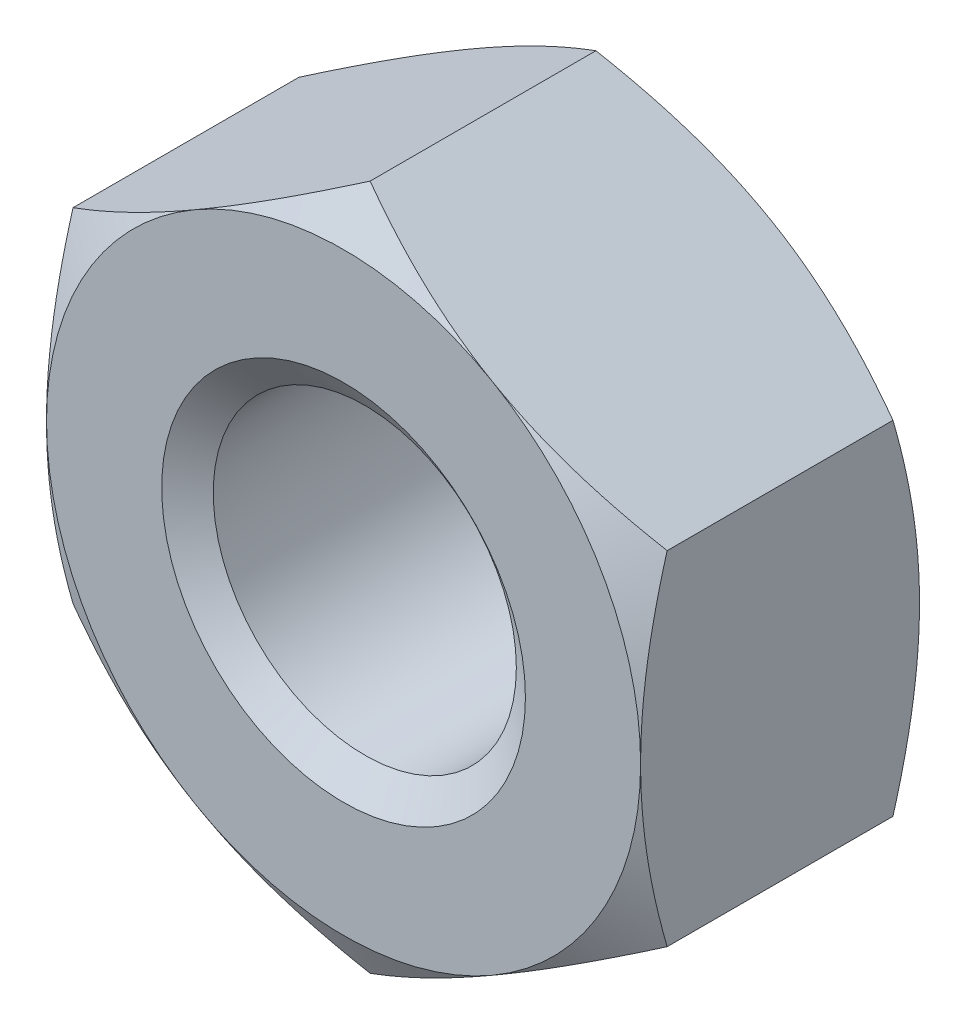
ISO-10303-21;
HEADER;
FILE_DESCRIPTION(('STEP AP214'),'2;1');
FILE_NAME('part.step','',(''),(''),'','','');
FILE_SCHEMA(('AUTOMOTIVE_DESIGN { 1 0 10303 214 1 1 1 1 }'));
ENDSEC;
DATA;
#1=APPLICATION_CONTEXT('core data for automotive mechanical design processes');
#2=APPLICATION_PROTOCOL_DEFINITION('international standard','automotive_design',2000,#1);
#3=PRODUCT_CONTEXT('',#1,'mechanical');
#4=PRODUCT('Part','Part','',(#3));
#5=PRODUCT_RELATED_PRODUCT_CATEGORY('part','',(#4));
#6=PRODUCT_DEFINITION_FORMATION('','',#4);
#7=PRODUCT_DEFINITION_CONTEXT('part definition',#1,'design');
#8=PRODUCT_DEFINITION('design','',#6,#7);
#9=PRODUCT_DEFINITION_SHAPE('','',#8);
#10=(LENGTH_UNIT() NAMED_UNIT(*) SI_UNIT(.MILLI.,.METRE.));
#11=(NAMED_UNIT(*) PLANE_ANGLE_UNIT() SI_UNIT($,.RADIAN.));
#12=(NAMED_UNIT(*) SI_UNIT($,.STERADIAN.) SOLID_ANGLE_UNIT());
#13=UNCERTAINTY_MEASURE_WITH_UNIT(LENGTH_MEASURE(1.E-05),#10,'distance_accuracy_value','');
#14=(GEOMETRIC_REPRESENTATION_CONTEXT(3) GLOBAL_UNCERTAINTY_ASSIGNED_CONTEXT((#13)) GLOBAL_UNIT_ASSIGNED_CONTEXT((#10,
#11,#12)) REPRESENTATION_CONTEXT('',''));
#15=CARTESIAN_POINT('',(0.,0.,0.));
#16=DIRECTION('',(0.,0.,1.));
#17=DIRECTION('',(1.,0.,0.));
#18=AXIS2_PLACEMENT_3D('',#15,#16,#17);
#19=CARTESIAN_POINT('',(0.,0.,-2.3));
#20=DIRECTION('',(0.,0.,1.));
#21=DIRECTION('',(1.,0.,0.));
#22=AXIS2_PLACEMENT_3D('',#19,#20,#21);
#23=CYLINDRICAL_SURFACE('',#22,1.25);
#24=CARTESIAN_POINT('',(0.,0.,-0.175051884552426));
#25=DIRECTION('',(0.,0.,1.));
#26=DIRECTION('',(1.,0.,0.));
#27=AXIS2_PLACEMENT_3D('',#24,#25,#26);
#28=CIRCLE('',#27,1.25);
#29=CARTESIAN_POINT('',(1.25,0.,-0.175051884552426));
#30=VERTEX_POINT('',#29);
#31=EDGE_CURVE('E176',#30,#30,#28,.F.);
#32=ORIENTED_EDGE('',*,*,#31,.F.);
#33=EDGE_LOOP('',(#32));
#34=FACE_BOUND('',#33,.T.);
#35=CARTESIAN_POINT('',(0.,0.,-2.09954811544757));
#36=DIRECTION('',(0.,0.,-1.));
#37=DIRECTION('',(-1.,0.,0.));
#38=AXIS2_PLACEMENT_3D('',#35,#36,#37);
#39=CIRCLE('',#38,1.25);
#40=CARTESIAN_POINT('',(-1.25,0.,-2.09954811544757));
#41=VERTEX_POINT('',#40);
#42=EDGE_CURVE('E41',#41,#41,#39,.F.);
#43=ORIENTED_EDGE('',*,*,#42,.F.);
#44=EDGE_LOOP('',(#43));
#45=FACE_BOUND('',#44,.T.);
#46=ADVANCED_FACE('F36',(#34,#45),#23,.F.);
#47=CARTESIAN_POINT('',(0.,2.82901631902917,-2.3));
#48=DIRECTION('',(0.,0.,-1.));
#49=DIRECTION('',(-1.,0.,0.));
#50=AXIS2_PLACEMENT_3D('',#47,#48,#49);
#51=PLANE('',#50);
#52=CARTESIAN_POINT('',(0.,0.,-2.3));
#53=DIRECTION('',(0.,0.,-1.));
#54=DIRECTION('',(-1.,0.,0.));
#55=AXIS2_PLACEMENT_3D('',#52,#53,#54);
#56=CIRCLE('',#55,2.45);
#57=CARTESIAN_POINT('',(-2.45,0.,-2.3));
#58=VERTEX_POINT('',#57);
#59=CARTESIAN_POINT('',(-1.225,-2.12176223927187,-2.3));
#60=VERTEX_POINT('',#59);
#61=EDGE_CURVE('E172',#58,#60,#56,.F.);
#62=ORIENTED_EDGE('',*,*,#61,.F.);
#63=CARTESIAN_POINT('',(-1.225,2.12176223927187,-2.3));
#64=VERTEX_POINT('',#63);
#65=EDGE_CURVE('E154',#64,#58,#56,.F.);
#66=ORIENTED_EDGE('',*,*,#65,.F.);
#67=CARTESIAN_POINT('',(1.225,2.12176223927187,-2.3));
#68=VERTEX_POINT('',#67);
#69=EDGE_CURVE('E171',#68,#64,#56,.F.);
#70=ORIENTED_EDGE('',*,*,#69,.F.);
#71=CARTESIAN_POINT('',(0.,0.,-2.3));
#72=DIRECTION('',(0.,0.,1.));
#73=DIRECTION('',(1.,0.,0.));
#74=AXIS2_PLACEMENT_3D('',#71,#72,#73);
#75=CIRCLE('',#74,2.45);
#76=CARTESIAN_POINT('',(2.45,0.,-2.3));
#77=VERTEX_POINT('',#76);
#78=EDGE_CURVE('E246',#77,#68,#75,.T.);
#79=ORIENTED_EDGE('',*,*,#78,.F.);
#80=CARTESIAN_POINT('',(1.225,-2.12176223927187,-2.3));
#81=VERTEX_POINT('',#80);
#82=EDGE_CURVE('E362',#81,#77,#56,.F.);
#83=ORIENTED_EDGE('',*,*,#82,.F.);
#84=EDGE_CURVE('E366',#60,#81,#56,.F.);
#85=ORIENTED_EDGE('',*,*,#84,.F.);
#86=EDGE_LOOP('',(#62,#66,#70,#79,#83,#85));
#87=FACE_BOUND('',#86,.T.);
#88=CARTESIAN_POINT('',(0.,0.,-2.3));
#89=DIRECTION('',(0.,0.,-1.));
#90=DIRECTION('',(-1.,0.,0.));
#91=AXIS2_PLACEMENT_3D('',#88,#89,#90);
#92=CIRCLE('',#91,1.5);
#93=CARTESIAN_POINT('',(-1.5,0.,-2.3));
#94=VERTEX_POINT('',#93);
#95=EDGE_CURVE('E179',#94,#94,#92,.F.);
#96=ORIENTED_EDGE('',*,*,#95,.T.);
#97=EDGE_LOOP('',(#96));
#98=FACE_BOUND('',#97,.T.);
#99=ADVANCED_FACE('F299',(#87,#98),#51,.T.);
#100=CARTESIAN_POINT('',(0.,2.82901631902917,0.));
#101=DIRECTION('',(0.,0.,-1.));
#102=DIRECTION('',(-1.,0.,0.));
#103=AXIS2_PLACEMENT_3D('',#100,#101,#102);
#104=PLANE('',#103);
#105=CARTESIAN_POINT('',(0.,0.,0.));
#106=DIRECTION('',(0.,0.,-1.));
#107=DIRECTION('',(-1.,0.,0.));
#108=AXIS2_PLACEMENT_3D('',#105,#106,#107);
#109=CIRCLE('',#108,2.45);
#110=CARTESIAN_POINT('',(-2.45,0.,0.));
#111=VERTEX_POINT('',#110);
#112=CARTESIAN_POINT('',(-1.225,2.12176223927187,0.));
#113=VERTEX_POINT('',#112);
#114=EDGE_CURVE('E11',#111,#113,#109,.T.);
#115=ORIENTED_EDGE('',*,*,#114,.F.);
#116=CARTESIAN_POINT('',(-1.225,-2.12176223927187,0.));
#117=VERTEX_POINT('',#116);
#118=EDGE_CURVE('E48',#117,#111,#109,.T.);
#119=ORIENTED_EDGE('',*,*,#118,.F.);
#120=CARTESIAN_POINT('',(1.225,-2.12176223927187,0.));
#121=VERTEX_POINT('',#120);
#122=EDGE_CURVE('E175',#121,#117,#109,.T.);
#123=ORIENTED_EDGE('',*,*,#122,.F.);
#124=CARTESIAN_POINT('',(2.45,0.,0.));
#125=VERTEX_POINT('',#124);
#126=EDGE_CURVE('E353',#125,#121,#109,.T.);
#127=ORIENTED_EDGE('',*,*,#126,.F.);
#128=CARTESIAN_POINT('',(0.,0.,0.));
#129=DIRECTION('',(0.,0.,1.));
#130=DIRECTION('',(1.,0.,0.));
#131=AXIS2_PLACEMENT_3D('',#128,#129,#130);
#132=CIRCLE('',#131,2.45);
#133=CARTESIAN_POINT('',(1.225,2.12176223927187,0.));
#134=VERTEX_POINT('',#133);
#135=EDGE_CURVE('E130',#125,#134,#132,.T.);
#136=ORIENTED_EDGE('',*,*,#135,.T.);
#137=EDGE_CURVE('E46',#113,#134,#109,.T.);
#138=ORIENTED_EDGE('',*,*,#137,.F.);
#139=EDGE_LOOP('',(#115,#119,#123,#127,#136,#138));
#140=FACE_BOUND('',#139,.T.);
#141=CARTESIAN_POINT('',(0.,0.,0.));
#142=DIRECTION('',(0.,0.,1.));
#143=DIRECTION('',(1.,0.,0.));
#144=AXIS2_PLACEMENT_3D('',#141,#142,#143);
#145=CIRCLE('',#144,1.5);
#146=CARTESIAN_POINT('',(1.5,0.,0.));
#147=VERTEX_POINT('',#146);
#148=EDGE_CURVE('E178',#147,#147,#145,.T.);
#149=ORIENTED_EDGE('',*,*,#148,.F.);
#150=EDGE_LOOP('',(#149));
#151=FACE_BOUND('',#150,.T.);
#152=ADVANCED_FACE('F251',(#140,#151),#104,.F.);
#153=CARTESIAN_POINT('',(0.,2.82901631902917,-2.3));
#154=DIRECTION('',(-0.500000000000001,0.866025403784438,0.));
#155=DIRECTION('',(-0.866025403784438,-0.500000000000001,0.));
#156=AXIS2_PLACEMENT_3D('',#153,#154,#155);
#157=PLANE('',#156);
#158=DIRECTION('',(0.,0.,1.));
#159=VECTOR('',#158,1.);
#160=CARTESIAN_POINT('',(-2.45,1.41450815951458,-2.3));
#161=LINE('',#160,#159);
#162=CARTESIAN_POINT('',(-2.45,1.41450815951459,-2.08117482618125));
#163=VERTEX_POINT('',#162);
#164=CARTESIAN_POINT('',(-2.45,1.41450815951458,-0.21882517381875));
#165=VERTEX_POINT('',#164);
#166=EDGE_CURVE('E166',#163,#165,#161,.T.);
#167=ORIENTED_EDGE('',*,*,#166,.T.);
#168=CARTESIAN_POINT('',(-2.4502,1.41439268946074,-0.218891844566883));
#169=CARTESIAN_POINT('',(-2.34253396244964,1.47655370522303,-0.182988411688321));
#170=CARTESIAN_POINT('',(-2.23393856064774,1.53925128968611,-0.150335282247698));
#171=CARTESIAN_POINT('',(-2.01486722518451,1.66573218418753,-0.0933383060848325));
#172=CARTESIAN_POINT('',(-1.9043873982785,1.72951774199174,-0.0690146238518089));
#173=CARTESIAN_POINT('',(-1.68479696694195,1.85629833663537,-0.031150432679854));
#174=CARTESIAN_POINT('',(-1.5757201535934,1.9192738641845,-0.0173579317076312));
#175=CARTESIAN_POINT('',(-1.35705315550793,2.04552131439203,-0.000891103358333379));
#176=CARTESIAN_POINT('',(-1.24746376582536,2.10879277802559,0.00179685843942371));
#177=CARTESIAN_POINT('',(-1.04268138665655,2.22702393976399,-0.00378828292929665));
#178=CARTESIAN_POINT('',(-0.947457777178242,2.2820013163295,-0.0106900424059905));
#179=CARTESIAN_POINT('',(-0.757630953811376,2.39159788389978,-0.0325666667375408));
#180=CARTESIAN_POINT('',(-0.663028396736148,2.44621669569319,-0.0475490081983304));
#181=CARTESIAN_POINT('',(-0.472810031788527,2.55603931990051,-0.0850045281449717));
#182=CARTESIAN_POINT('',(-0.377218305088479,2.61122922904308,-0.107636515215253));
#183=CARTESIAN_POINT('',(-0.187460766164464,2.72078579522162,-0.159002542730696));
#184=CARTESIAN_POINT('',(-0.0932925219413348,2.77515385637296,-0.187724510096738));
#185=CARTESIAN_POINT('',(0.00019999999999996,2.82913178908301,-0.218891844566885));
#186=B_SPLINE_CURVE_WITH_KNOTS('',3,(#168,#169,#170,#171,#172,#173,#174,#175,#176,#177,#178,
#179,#180,#181,#182,#183,#184,#185),.UNSPECIFIED.,.F.,.F.,(4,2,2,2,2,2,2,2,4),(0.,
0.388360427091477,0.777654484763214,1.15731317842199,1.53650557919442,1.86670472342472,
2.19720991179685,2.53504727484869,2.87222105175885),.UNSPECIFIED.);
#187=EDGE_CURVE('E135',#165,#113,#186,.T.);
#188=ORIENTED_EDGE('',*,*,#187,.T.);
#189=CARTESIAN_POINT('',(0.,2.82901631902917,-0.218825173818752));
#190=VERTEX_POINT('',#189);
#191=EDGE_CURVE('E55',#113,#190,#186,.T.);
#192=ORIENTED_EDGE('',*,*,#191,.T.);
#193=DIRECTION('',(0.,0.,1.));
#194=VECTOR('',#193,1.);
#195=CARTESIAN_POINT('',(0.,2.82901631902917,-2.3));
#196=LINE('',#195,#194);
#197=CARTESIAN_POINT('',(0.,2.82901631902917,-2.08117482618125));
#198=VERTEX_POINT('',#197);
#199=EDGE_CURVE('E151',#198,#190,#196,.T.);
#200=ORIENTED_EDGE('',*,*,#199,.F.);
#201=CARTESIAN_POINT('',(-2.4502,1.41439268946074,-2.08110815543312));
#202=CARTESIAN_POINT('',(-2.34253396244964,1.47655370522303,-2.11701158831168));
#203=CARTESIAN_POINT('',(-2.23393856064774,1.53925128968611,-2.1496647177523));
#204=CARTESIAN_POINT('',(-2.01486722518451,1.66573218418753,-2.20666169391517));
#205=CARTESIAN_POINT('',(-1.9043873982785,1.72951774199174,-2.23098537614819));
#206=CARTESIAN_POINT('',(-1.68479696694195,1.85629833663537,-2.26884956732015));
#207=CARTESIAN_POINT('',(-1.5757201535934,1.9192738641845,-2.28264206829237));
#208=CARTESIAN_POINT('',(-1.35705315550793,2.04552131439203,-2.29910889664167));
#209=CARTESIAN_POINT('',(-1.24746376582536,2.10879277802559,-2.30179685843942));
#210=CARTESIAN_POINT('',(-1.04268138665655,2.22702393976399,-2.2962117170707));
#211=CARTESIAN_POINT('',(-0.947457777178242,2.2820013163295,-2.28930995759401));
#212=CARTESIAN_POINT('',(-0.757630953811376,2.39159788389978,-2.26743333326246));
#213=CARTESIAN_POINT('',(-0.663028396736148,2.44621669569319,-2.25245099180167));
#214=CARTESIAN_POINT('',(-0.472810031788527,2.55603931990051,-2.21499547185503));
#215=CARTESIAN_POINT('',(-0.377218305088479,2.61122922904308,-2.19236348478475));
#216=CARTESIAN_POINT('',(-0.187460766164464,2.72078579522162,-2.1409974572693));
#217=CARTESIAN_POINT('',(-0.0932925219413351,2.77515385637296,-2.11227548990326));
#218=CARTESIAN_POINT('',(0.000199999999999954,2.82913178908301,-2.08110815543312));
#219=B_SPLINE_CURVE_WITH_KNOTS('',3,(#201,#202,#203,#204,#205,#206,#207,#208,#209,#210,#211,
#212,#213,#214,#215,#216,#217,#218),.UNSPECIFIED.,.F.,.F.,(4,2,2,2,2,2,2,2,4),(0.,
0.388360427091477,0.777654484763214,1.15731317842199,1.53650557919442,1.86670472342472,
2.19720991179685,2.53504727484869,2.87222105175885),.UNSPECIFIED.);
#220=EDGE_CURVE('E169',#64,#198,#219,.T.);
#221=ORIENTED_EDGE('',*,*,#220,.F.);
#222=EDGE_CURVE('E261',#163,#64,#219,.T.);
#223=ORIENTED_EDGE('',*,*,#222,.F.);
#224=EDGE_LOOP('',(#167,#188,#192,#200,#221,#223));
#225=FACE_BOUND('',#224,.T.);
#226=ADVANCED_FACE('F38',(#225),#157,.T.);
#227=CARTESIAN_POINT('',(2.45,1.41450815951458,-2.3));
#228=DIRECTION('',(0.500000000000001,0.866025403784438,0.));
#229=DIRECTION('',(-0.866025403784438,0.500000000000001,0.));
#230=AXIS2_PLACEMENT_3D('',#227,#228,#229);
#231=PLANE('',#230);
#232=ORIENTED_EDGE('',*,*,#199,.T.);
#233=CARTESIAN_POINT('',(-0.000200000000000147,2.82913178908301,-0.218891844566885));
#234=CARTESIAN_POINT('',(0.107466037550362,2.76697077332073,-0.182988411688324));
#235=CARTESIAN_POINT('',(0.21606143935226,2.70427318885764,-0.1503352822477));
#236=CARTESIAN_POINT('',(0.435132774815491,2.57779229435622,-0.0933383060848341));
#237=CARTESIAN_POINT('',(0.545612601721502,2.51400673655201,-0.0690146238518103));
#238=CARTESIAN_POINT('',(0.765203033058053,2.38722614190838,-0.0311504326798548));
#239=CARTESIAN_POINT('',(0.874279846406602,2.32425061435925,-0.0173579317076318));
#240=CARTESIAN_POINT('',(1.09294684449207,2.19800316415172,-0.000891103358333555));
#241=CARTESIAN_POINT('',(1.20253623417464,2.13473170051816,0.0017968584394237));
#242=CARTESIAN_POINT('',(1.40731861334345,2.01650053877976,-0.00378828292929651));
#243=CARTESIAN_POINT('',(1.50254222282176,1.96152316221425,-0.0106900424059903));
#244=CARTESIAN_POINT('',(1.69236904618863,1.85192659464397,-0.0325666667375405));
#245=CARTESIAN_POINT('',(1.78697160326385,1.79730778285056,-0.04754900819833));
#246=CARTESIAN_POINT('',(1.97718996821147,1.68748515864324,-0.0850045281449708));
#247=CARTESIAN_POINT('',(2.07278169491152,1.63229524950067,-0.107636515215252));
#248=CARTESIAN_POINT('',(2.26253923383554,1.52273868332213,-0.159002542730694));
#249=CARTESIAN_POINT('',(2.35670747805867,1.46837062217079,-0.187724510096736));
#250=CARTESIAN_POINT('',(2.4502,1.41439268946074,-0.218891844566883));
#251=B_SPLINE_CURVE_WITH_KNOTS('',3,(#233,#234,#235,#236,#237,#238,#239,#240,#241,#242,#243,
#244,#245,#246,#247,#248,#249,#250),.UNSPECIFIED.,.F.,.F.,(4,2,2,2,2,2,2,2,4),(0.,
0.388360427091477,0.777654484763215,1.15731317842199,1.53650557919443,1.86670472342473,
2.19720991179685,2.53504727484869,2.87222105175885),.UNSPECIFIED.);
#252=EDGE_CURVE('E145',#190,#134,#251,.T.);
#253=ORIENTED_EDGE('',*,*,#252,.T.);
#254=CARTESIAN_POINT('',(2.45,1.41450815951459,-0.218825173818752));
#255=VERTEX_POINT('',#254);
#256=EDGE_CURVE('E62',#134,#255,#251,.T.);
#257=ORIENTED_EDGE('',*,*,#256,.T.);
#258=DIRECTION('',(0.,0.,1.));
#259=VECTOR('',#258,1.);
#260=CARTESIAN_POINT('',(2.45,1.41450815951458,-2.3));
#261=LINE('',#260,#259);
#262=CARTESIAN_POINT('',(2.45,1.41450815951459,-2.08117482618125));
#263=VERTEX_POINT('',#262);
#264=EDGE_CURVE('E144',#263,#255,#261,.T.);
#265=ORIENTED_EDGE('',*,*,#264,.F.);
#266=CARTESIAN_POINT('',(-0.000200000000000154,2.82913178908301,-2.08110815543312));
#267=CARTESIAN_POINT('',(0.107466037550362,2.76697077332073,-2.11701158831168));
#268=CARTESIAN_POINT('',(0.21606143935226,2.70427318885764,-2.1496647177523));
#269=CARTESIAN_POINT('',(0.435132774815491,2.57779229435622,-2.20666169391517));
#270=CARTESIAN_POINT('',(0.545612601721502,2.51400673655201,-2.23098537614819));
#271=CARTESIAN_POINT('',(0.765203033058053,2.38722614190838,-2.26884956732014));
#272=CARTESIAN_POINT('',(0.874279846406602,2.32425061435925,-2.28264206829237));
#273=CARTESIAN_POINT('',(1.09294684449207,2.19800316415172,-2.29910889664167));
#274=CARTESIAN_POINT('',(1.20253623417464,2.13473170051816,-2.30179685843942));
#275=CARTESIAN_POINT('',(1.40731861334345,2.01650053877976,-2.2962117170707));
#276=CARTESIAN_POINT('',(1.50254222282176,1.96152316221425,-2.28930995759401));
#277=CARTESIAN_POINT('',(1.69236904618863,1.85192659464397,-2.26743333326246));
#278=CARTESIAN_POINT('',(1.78697160326385,1.79730778285056,-2.25245099180167));
#279=CARTESIAN_POINT('',(1.97718996821147,1.68748515864324,-2.21499547185503));
#280=CARTESIAN_POINT('',(2.07278169491152,1.63229524950067,-2.19236348478475));
#281=CARTESIAN_POINT('',(2.26253923383554,1.52273868332213,-2.14099745726931));
#282=CARTESIAN_POINT('',(2.35670747805867,1.46837062217079,-2.11227548990326));
#283=CARTESIAN_POINT('',(2.4502,1.41439268946074,-2.08110815543312));
#284=B_SPLINE_CURVE_WITH_KNOTS('',3,(#266,#267,#268,#269,#270,#271,#272,#273,#274,#275,#276,
#277,#278,#279,#280,#281,#282,#283),.UNSPECIFIED.,.F.,.F.,(4,2,2,2,2,2,2,2,4),(0.,
0.388360427091477,0.777654484763215,1.15731317842199,1.53650557919443,1.86670472342473,
2.19720991179685,2.53504727484869,2.87222105175885),.UNSPECIFIED.);
#285=EDGE_CURVE('E255',#68,#263,#284,.T.);
#286=ORIENTED_EDGE('',*,*,#285,.F.);
#287=EDGE_CURVE('E260',#198,#68,#284,.T.);
#288=ORIENTED_EDGE('',*,*,#287,.F.);
#289=EDGE_LOOP('',(#232,#253,#257,#265,#286,#288));
#290=FACE_BOUND('',#289,.T.);
#291=ADVANCED_FACE('F142',(#290),#231,.T.);
#292=CARTESIAN_POINT('',(2.45,1.41450815951458,-2.3));
#293=DIRECTION('',(-1.,0.,0.));
#294=DIRECTION('',(0.,0.,1.));
#295=AXIS2_PLACEMENT_3D('',#292,#293,#294);
#296=PLANE('',#295);
#297=CARTESIAN_POINT('',(2.45,-3.75148409384984,-1.17239042800989));
#298=CARTESIAN_POINT('',(2.45,-3.64391523936189,-1.12040721584473));
#299=CARTESIAN_POINT('',(2.45,-3.53609205658363,-1.06894075983203));
#300=CARTESIAN_POINT('',(2.45,-3.31979951926497,-0.967336652413264));
#301=CARTESIAN_POINT('',(2.45,-3.21133005677706,-0.91719923107493));
#302=CARTESIAN_POINT('',(2.45,-2.9930215015788,-0.818284358623367));
#303=CARTESIAN_POINT('',(2.45,-2.88317812319734,-0.769516331976111));
#304=CARTESIAN_POINT('',(2.45,-2.66258855032699,-0.674074983569933));
#305=CARTESIAN_POINT('',(2.45,-2.55184240325417,-0.627401552623663));
#306=CARTESIAN_POINT('',(2.45,-2.32789632881299,-0.536152273366547));
#307=CARTESIAN_POINT('',(2.45,-2.21468296853947,-0.491609211582206));
#308=CARTESIAN_POINT('',(2.45,-1.98692088661918,-0.406011691462645));
#309=CARTESIAN_POINT('',(2.45,-1.87237201801178,-0.364957621259484));
#310=CARTESIAN_POINT('',(2.45,-1.64199194930435,-0.287441195913915));
#311=CARTESIAN_POINT('',(2.45,-1.5261640677412,-0.250969078805101));
#312=CARTESIAN_POINT('',(2.45,-1.29286165964459,-0.18380105588351));
#313=CARTESIAN_POINT('',(2.45,-1.17538766651271,-0.153103323427011));
#314=CARTESIAN_POINT('',(2.45,-0.938712800276475,-0.0989743619093507));
#315=CARTESIAN_POINT('',(2.45,-0.819511476193855,-0.0755450676483809));
#316=CARTESIAN_POINT('',(2.45,-0.57967166959694,-0.0375304695024354));
#317=CARTESIAN_POINT('',(2.45,-0.459033185812112,-0.0229451734366657));
#318=CARTESIAN_POINT('',(2.45,-0.217714343647115,-0.00390886055402975));
#319=CARTESIAN_POINT('',(2.45,-0.0970391780450822,0.000606314216137866));
#320=CARTESIAN_POINT('',(2.45,0.144226652434574,-0.000737490654562201));
#321=CARTESIAN_POINT('',(2.45,0.264817331116225,-0.00659377737440221));
#322=CARTESIAN_POINT('',(2.45,0.470743389075629,-0.0250382249508244));
#323=CARTESIAN_POINT('',(2.45,0.556305953758864,-0.035224443826895));
#324=CARTESIAN_POINT('',(2.45,0.72677013801392,-0.060155713837349));
#325=CARTESIAN_POINT('',(2.45,0.811671651181206,-0.0749014839482985));
#326=CARTESIAN_POINT('',(2.45,1.06531540339944,-0.125204230957017));
#327=CARTESIAN_POINT('',(2.45,1.23286872948842,-0.166813692935407));
#328=CARTESIAN_POINT('',(2.45,1.48358679971396,-0.238578770081788));
#329=CARTESIAN_POINT('',(2.45,1.56805841021442,-0.264424789359628));
#330=CARTESIAN_POINT('',(2.45,1.7361199744961,-0.318674305389505));
#331=CARTESIAN_POINT('',(2.45,1.81971049256929,-0.347076038164485));
#332=CARTESIAN_POINT('',(2.45,1.98566032316259,-0.405845990747927));
#333=CARTESIAN_POINT('',(2.45,2.06802391742438,-0.43620224202402));
#334=CARTESIAN_POINT('',(2.45,2.2321120745616,-0.498696491696806));
#335=CARTESIAN_POINT('',(2.45,2.31383636371625,-0.530835210215065));
#336=CARTESIAN_POINT('',(2.45,2.39526515629344,-0.563689266506849));
#337=B_SPLINE_CURVE_WITH_KNOTS('',3,(#297,#298,#299,#300,#301,#302,#303,#304,#305,#306,#307,
#308,#309,#310,#311,#312,#313,#314,#315,#316,#317,#318,#319,#320,#321,#322,#323,#324,#325,#326,
#327,#328,#329,#330,#331,#332,#333,#334,#335,#336),.UNSPECIFIED.,.F.,.F.,(4,2,2,2,2,2,2,2,2,2,2,
2,2,2,2,2,2,2,2,4),(0.,0.358417722926016,0.716897091242051,1.07742789220669,1.43793987749456,
1.80287783110959,2.16785632916547,2.5320435462728,2.89611536352276,3.26028401079055,
3.62445298002873,3.98629507585597,4.3480432341668,4.60641736255632,4.86483225367639,
5.38204663457896,5.64703735162335,5.91184655233732,6.17516522896069,6.43859107313387),.UNSPECIFIED.);
#338=CARTESIAN_POINT('',(2.45,-1.41450815951459,-0.218825173818752));
#339=VERTEX_POINT('',#338);
#340=EDGE_CURVE('E137',#339,#125,#337,.T.);
#341=ORIENTED_EDGE('',*,*,#340,.F.);
#342=DIRECTION('',(0.,0.,1.));
#343=VECTOR('',#342,1.);
#344=CARTESIAN_POINT('',(2.45,-1.41450815951459,-2.3));
#345=LINE('',#344,#343);
#346=CARTESIAN_POINT('',(2.45,-1.41450815951459,-2.08117482618125));
#347=VERTEX_POINT('',#346);
#348=EDGE_CURVE('E152',#347,#339,#345,.T.);
#349=ORIENTED_EDGE('',*,*,#348,.F.);
#350=CARTESIAN_POINT('',(2.45,-3.75148409384984,-1.12760957199011));
#351=CARTESIAN_POINT('',(2.45,-3.64391523936189,-1.17959278415527));
#352=CARTESIAN_POINT('',(2.45,-3.53609205658363,-1.23105924016797));
#353=CARTESIAN_POINT('',(2.45,-3.31979951926497,-1.33266334758674));
#354=CARTESIAN_POINT('',(2.45,-3.21133005677706,-1.38280076892507));
#355=CARTESIAN_POINT('',(2.45,-2.9930215015788,-1.48171564137663));
#356=CARTESIAN_POINT('',(2.45,-2.88317812319734,-1.53048366802389));
#357=CARTESIAN_POINT('',(2.45,-2.66258855032699,-1.62592501643007));
#358=CARTESIAN_POINT('',(2.45,-2.55184240325417,-1.67259844737634));
#359=CARTESIAN_POINT('',(2.45,-2.32789632881299,-1.76384772663345));
#360=CARTESIAN_POINT('',(2.45,-2.21468296853947,-1.80839078841779));
#361=CARTESIAN_POINT('',(2.45,-1.98692088661918,-1.89398830853735));
#362=CARTESIAN_POINT('',(2.45,-1.87237201801178,-1.93504237874052));
#363=CARTESIAN_POINT('',(2.45,-1.64199194930434,-2.01255880408608));
#364=CARTESIAN_POINT('',(2.45,-1.5261640677412,-2.0490309211949));
#365=CARTESIAN_POINT('',(2.45,-1.29286165964459,-2.11619894411649));
#366=CARTESIAN_POINT('',(2.45,-1.17538766651271,-2.14689667657299));
#367=CARTESIAN_POINT('',(2.45,-0.938712800276475,-2.20102563809065));
#368=CARTESIAN_POINT('',(2.45,-0.819511476193854,-2.22445493235162));
#369=CARTESIAN_POINT('',(2.45,-0.579671669596939,-2.26246953049756));
#370=CARTESIAN_POINT('',(2.45,-0.459033185812112,-2.27705482656333));
#371=CARTESIAN_POINT('',(2.45,-0.217714343647115,-2.29609113944597));
#372=CARTESIAN_POINT('',(2.45,-0.0970391780450819,-2.30060631421614));
#373=CARTESIAN_POINT('',(2.45,0.144226652434574,-2.29926250934544));
#374=CARTESIAN_POINT('',(2.45,0.264817331116225,-2.2934062226256));
#375=CARTESIAN_POINT('',(2.45,0.470743389075628,-2.27496177504918));
#376=CARTESIAN_POINT('',(2.45,0.556305953758864,-2.26477555617311));
#377=CARTESIAN_POINT('',(2.45,0.72677013801392,-2.23984428616265));
#378=CARTESIAN_POINT('',(2.45,0.811671651181206,-2.2250985160517));
#379=CARTESIAN_POINT('',(2.45,1.06531540339944,-2.17479576904298));
#380=CARTESIAN_POINT('',(2.45,1.23286872948842,-2.13318630706459));
#381=CARTESIAN_POINT('',(2.45,1.48358679971396,-2.06142122991821));
#382=CARTESIAN_POINT('',(2.45,1.56805841021442,-2.03557521064037));
#383=CARTESIAN_POINT('',(2.45,1.7361199744961,-1.98132569461049));
#384=CARTESIAN_POINT('',(2.45,1.81971049256929,-1.95292396183552));
#385=CARTESIAN_POINT('',(2.45,1.98566032316259,-1.89415400925207));
#386=CARTESIAN_POINT('',(2.45,2.06802391742438,-1.86379775797598));
#387=CARTESIAN_POINT('',(2.45,2.2321120745616,-1.80130350830319));
#388=CARTESIAN_POINT('',(2.45,2.31383636371625,-1.76916478978494));
#389=CARTESIAN_POINT('',(2.45,2.39526515629344,-1.73631073349315));
#390=B_SPLINE_CURVE_WITH_KNOTS('',3,(#350,#351,#352,#353,#354,#355,#356,#357,#358,#359,#360,
#361,#362,#363,#364,#365,#366,#367,#368,#369,#370,#371,#372,#373,#374,#375,#376,#377,#378,#379,
#380,#381,#382,#383,#384,#385,#386,#387,#388,#389),.UNSPECIFIED.,.F.,.F.,(4,2,2,2,2,2,2,2,2,2,2,
2,2,2,2,2,2,2,2,4),(0.,0.358417722926016,0.716897091242051,1.07742789220669,1.43793987749456,
1.80287783110958,2.16785632916547,2.5320435462728,2.89611536352276,3.26028401079055,
3.62445298002873,3.98629507585597,4.3480432341668,4.60641736255632,4.86483225367639,
5.38204663457896,5.64703735162335,5.91184655233732,6.17516522896069,6.43859107313387),.UNSPECIFIED.);
#391=EDGE_CURVE('E267',#347,#77,#390,.T.);
#392=ORIENTED_EDGE('',*,*,#391,.T.);
#393=EDGE_CURVE('E150',#77,#263,#390,.T.);
#394=ORIENTED_EDGE('',*,*,#393,.T.);
#395=ORIENTED_EDGE('',*,*,#264,.T.);
#396=EDGE_CURVE('E127',#125,#255,#337,.T.);
#397=ORIENTED_EDGE('',*,*,#396,.F.);
#398=EDGE_LOOP('',(#341,#349,#392,#394,#395,#397));
#399=FACE_BOUND('',#398,.T.);
#400=ADVANCED_FACE('F148',(#399),#296,.F.);
#401=CARTESIAN_POINT('',(0.,-2.82901631902917,-2.3));
#402=DIRECTION('',(0.500000000000001,-0.866025403784438,0.));
#403=DIRECTION('',(0.866025403784438,0.500000000000001,0.));
#404=AXIS2_PLACEMENT_3D('',#401,#402,#403);
#405=PLANE('',#404);
#406=ORIENTED_EDGE('',*,*,#348,.T.);
#407=CARTESIAN_POINT('',(2.4502,-1.41439268946075,-0.218891844566884));
#408=CARTESIAN_POINT('',(2.34253396244964,-1.47655370522303,-0.182988411688323));
#409=CARTESIAN_POINT('',(2.23393856064774,-1.53925128968611,-0.1503352822477));
#410=CARTESIAN_POINT('',(2.01486722518451,-1.66573218418754,-0.0933383060848342));
#411=CARTESIAN_POINT('',(1.9043873982785,-1.72951774199175,-0.0690146238518105));
#412=CARTESIAN_POINT('',(1.68479696694195,-1.85629833663537,-0.0311504326798556));
#413=CARTESIAN_POINT('',(1.5757201535934,-1.9192738641845,-0.017357931707633));
#414=CARTESIAN_POINT('',(1.35705315550793,-2.04552131439203,-0.000891103358335293));
#415=CARTESIAN_POINT('',(1.24746376582536,-2.1087927780256,0.00179685843942171));
#416=CARTESIAN_POINT('',(1.04268138665655,-2.227023939764,-0.003788282929299));
#417=CARTESIAN_POINT('',(0.947457777178241,-2.28200131632951,-0.0106900424059931));
#418=CARTESIAN_POINT('',(0.757630953811375,-2.39159788389978,-0.0325666667375436));
#419=CARTESIAN_POINT('',(0.663028396736147,-2.44621669569319,-0.0475490081983331));
#420=CARTESIAN_POINT('',(0.472810031788527,-2.55603931990051,-0.0850045281449742));
#421=CARTESIAN_POINT('',(0.377218305088479,-2.61122922904308,-0.107636515215256));
#422=CARTESIAN_POINT('',(0.187460766164464,-2.72078579522163,-0.159002542730698));
#423=CARTESIAN_POINT('',(0.0932925219413352,-2.77515385637296,-0.18772451009674));
#424=CARTESIAN_POINT('',(-0.000199999999999552,-2.82913178908301,-0.218891844566887));
#425=B_SPLINE_CURVE_WITH_KNOTS('',3,(#407,#408,#409,#410,#411,#412,#413,#414,#415,#416,#417,
#418,#419,#420,#421,#422,#423,#424),.UNSPECIFIED.,.F.,.F.,(4,2,2,2,2,2,2,2,4),(0.,
0.388360427091478,0.777654484763215,1.15731317842199,1.53650557919443,1.86670472342473,
2.19720991179685,2.53504727484869,2.87222105175885),.UNSPECIFIED.);
#426=EDGE_CURVE('E348',#339,#121,#425,.T.);
#427=ORIENTED_EDGE('',*,*,#426,.T.);
#428=CARTESIAN_POINT('',(0.,-2.82901631902917,-0.218825173818752));
#429=VERTEX_POINT('',#428);
#430=EDGE_CURVE('E227',#121,#429,#425,.T.);
#431=ORIENTED_EDGE('',*,*,#430,.T.);
#432=DIRECTION('',(0.,0.,1.));
#433=VECTOR('',#432,1.);
#434=CARTESIAN_POINT('',(0.,-2.82901631902917,-2.3));
#435=LINE('',#434,#433);
#436=CARTESIAN_POINT('',(0.,-2.82901631902917,-2.08117482618125));
#437=VERTEX_POINT('',#436);
#438=EDGE_CURVE('E157',#437,#429,#435,.T.);
#439=ORIENTED_EDGE('',*,*,#438,.F.);
#440=CARTESIAN_POINT('',(2.4502,-1.41439268946075,-2.08110815543312));
#441=CARTESIAN_POINT('',(2.34253396244964,-1.47655370522303,-2.11701158831168));
#442=CARTESIAN_POINT('',(2.23393856064774,-1.53925128968611,-2.1496647177523));
#443=CARTESIAN_POINT('',(2.01486722518451,-1.66573218418754,-2.20666169391517));
#444=CARTESIAN_POINT('',(1.9043873982785,-1.72951774199175,-2.23098537614819));
#445=CARTESIAN_POINT('',(1.68479696694195,-1.85629833663537,-2.26884956732014));
#446=CARTESIAN_POINT('',(1.5757201535934,-1.9192738641845,-2.28264206829237));
#447=CARTESIAN_POINT('',(1.35705315550793,-2.04552131439203,-2.29910889664166));
#448=CARTESIAN_POINT('',(1.24746376582536,-2.1087927780256,-2.30179685843942));
#449=CARTESIAN_POINT('',(1.04268138665655,-2.227023939764,-2.2962117170707));
#450=CARTESIAN_POINT('',(0.947457777178241,-2.28200131632951,-2.28930995759401));
#451=CARTESIAN_POINT('',(0.757630953811375,-2.39159788389978,-2.26743333326246));
#452=CARTESIAN_POINT('',(0.663028396736147,-2.44621669569319,-2.25245099180167));
#453=CARTESIAN_POINT('',(0.472810031788526,-2.55603931990051,-2.21499547185503));
#454=CARTESIAN_POINT('',(0.377218305088479,-2.61122922904308,-2.19236348478474));
#455=CARTESIAN_POINT('',(0.187460766164464,-2.72078579522163,-2.1409974572693));
#456=CARTESIAN_POINT('',(0.0932925219413349,-2.77515385637296,-2.11227548990326));
#457=CARTESIAN_POINT('',(-0.00019999999999988,-2.82913178908301,-2.08110815543311));
#458=B_SPLINE_CURVE_WITH_KNOTS('',3,(#440,#441,#442,#443,#444,#445,#446,#447,#448,#449,#450,
#451,#452,#453,#454,#455,#456,#457),.UNSPECIFIED.,.F.,.F.,(4,2,2,2,2,2,2,2,4),(0.,
0.388360427091477,0.777654484763215,1.15731317842199,1.53650557919443,1.86670472342473,
2.19720991179685,2.53504727484869,2.87222105175885),.UNSPECIFIED.);
#459=EDGE_CURVE('E273',#81,#437,#458,.T.);
#460=ORIENTED_EDGE('',*,*,#459,.F.);
#461=EDGE_CURVE('E272',#347,#81,#458,.T.);
#462=ORIENTED_EDGE('',*,*,#461,.F.);
#463=EDGE_LOOP('',(#406,#427,#431,#439,#460,#462));
#464=FACE_BOUND('',#463,.T.);
#465=ADVANCED_FACE('F283',(#464),#405,.T.);
#466=CARTESIAN_POINT('',(-2.45,-1.41450815951459,-2.3));
#467=DIRECTION('',(-0.500000000000001,-0.866025403784438,0.));
#468=DIRECTION('',(0.866025403784438,-0.500000000000001,0.));
#469=AXIS2_PLACEMENT_3D('',#466,#467,#468);
#470=PLANE('',#469);
#471=ORIENTED_EDGE('',*,*,#438,.T.);
#472=CARTESIAN_POINT('',(0.000200000000000188,-2.82913178908301,-0.218891844566887));
#473=CARTESIAN_POINT('',(-0.107466037550363,-2.76697077332073,-0.182988411688326));
#474=CARTESIAN_POINT('',(-0.216061439352261,-2.70427318885765,-0.150335282247703));
#475=CARTESIAN_POINT('',(-0.435132774815492,-2.57779229435622,-0.0933383060848362));
#476=CARTESIAN_POINT('',(-0.545612601721503,-2.51400673655201,-0.0690146238518122));
#477=CARTESIAN_POINT('',(-0.765203033058055,-2.38722614190839,-0.0311504326798568));
#478=CARTESIAN_POINT('',(-0.874279846406604,-2.32425061435925,-0.0173579317076341));
#479=CARTESIAN_POINT('',(-1.09294684449207,-2.19800316415172,-0.000891103358336017));
#480=CARTESIAN_POINT('',(-1.20253623417464,-2.13473170051816,0.00179685843942135));
#481=CARTESIAN_POINT('',(-1.40731861334345,-2.01650053877976,-0.00378828292929879));
#482=CARTESIAN_POINT('',(-1.50254222282176,-1.96152316221425,-0.0106900424059926));
#483=CARTESIAN_POINT('',(-1.69236904618863,-1.85192659464398,-0.0325666667375427));
#484=CARTESIAN_POINT('',(-1.78697160326386,-1.79730778285057,-0.0475490081983321));
#485=CARTESIAN_POINT('',(-1.97718996821148,-1.68748515864325,-0.0850045281449727));
#486=CARTESIAN_POINT('',(-2.07278169491152,-1.63229524950067,-0.107636515215254));
#487=CARTESIAN_POINT('',(-2.26253923383554,-1.52273868332213,-0.159002542730696));
#488=CARTESIAN_POINT('',(-2.35670747805867,-1.4683706221708,-0.187724510096737));
#489=CARTESIAN_POINT('',(-2.4502,-1.41439268946075,-0.218891844566884));
#490=B_SPLINE_CURVE_WITH_KNOTS('',3,(#472,#473,#474,#475,#476,#477,#478,#479,#480,#481,#482,
#483,#484,#485,#486,#487,#488,#489),.UNSPECIFIED.,.F.,.F.,(4,2,2,2,2,2,2,2,4),(0.,
0.388360427091478,0.777654484763216,1.15731317842199,1.53650557919443,1.86670472342473,
2.19720991179685,2.53504727484869,2.87222105175885),.UNSPECIFIED.);
#491=EDGE_CURVE('E346',#429,#117,#490,.T.);
#492=ORIENTED_EDGE('',*,*,#491,.T.);
#493=CARTESIAN_POINT('',(-2.45,-1.41450815951459,-0.218825173818752));
#494=VERTEX_POINT('',#493);
#495=EDGE_CURVE('E201',#117,#494,#490,.T.);
#496=ORIENTED_EDGE('',*,*,#495,.T.);
#497=DIRECTION('',(0.,0.,1.));
#498=VECTOR('',#497,1.);
#499=CARTESIAN_POINT('',(-2.45,-1.41450815951459,-2.3));
#500=LINE('',#499,#498);
#501=CARTESIAN_POINT('',(-2.45,-1.41450815951459,-2.08117482618125));
#502=VERTEX_POINT('',#501);
#503=EDGE_CURVE('E163',#502,#494,#500,.T.);
#504=ORIENTED_EDGE('',*,*,#503,.F.);
#505=CARTESIAN_POINT('',(0.000200000000000188,-2.82913178908301,-2.08110815543311));
#506=CARTESIAN_POINT('',(-0.107466037550363,-2.76697077332073,-2.11701158831167));
#507=CARTESIAN_POINT('',(-0.216061439352261,-2.70427318885765,-2.1496647177523));
#508=CARTESIAN_POINT('',(-0.435132774815493,-2.57779229435622,-2.20666169391516));
#509=CARTESIAN_POINT('',(-0.545612601721503,-2.51400673655201,-2.23098537614819));
#510=CARTESIAN_POINT('',(-0.765203033058055,-2.38722614190839,-2.26884956732014));
#511=CARTESIAN_POINT('',(-0.874279846406604,-2.32425061435925,-2.28264206829237));
#512=CARTESIAN_POINT('',(-1.09294684449207,-2.19800316415172,-2.29910889664166));
#513=CARTESIAN_POINT('',(-1.20253623417464,-2.13473170051816,-2.30179685843942));
#514=CARTESIAN_POINT('',(-1.40731861334345,-2.01650053877976,-2.2962117170707));
#515=CARTESIAN_POINT('',(-1.50254222282176,-1.96152316221425,-2.28930995759401));
#516=CARTESIAN_POINT('',(-1.69236904618863,-1.85192659464398,-2.26743333326246));
#517=CARTESIAN_POINT('',(-1.78697160326386,-1.79730778285057,-2.25245099180167));
#518=CARTESIAN_POINT('',(-1.97718996821148,-1.68748515864325,-2.21499547185503));
#519=CARTESIAN_POINT('',(-2.07278169491152,-1.63229524950067,-2.19236348478475));
#520=CARTESIAN_POINT('',(-2.26253923383554,-1.52273868332213,-2.1409974572693));
#521=CARTESIAN_POINT('',(-2.35670747805867,-1.4683706221708,-2.11227548990326));
#522=CARTESIAN_POINT('',(-2.4502,-1.41439268946075,-2.08110815543312));
#523=B_SPLINE_CURVE_WITH_KNOTS('',3,(#505,#506,#507,#508,#509,#510,#511,#512,#513,#514,#515,
#516,#517,#518,#519,#520,#521,#522),.UNSPECIFIED.,.F.,.F.,(4,2,2,2,2,2,2,2,4),(0.,
0.388360427091478,0.777654484763216,1.15731317842199,1.53650557919443,1.86670472342473,
2.19720991179685,2.53504727484869,2.87222105175885),.UNSPECIFIED.);
#524=EDGE_CURVE('E279',#60,#502,#523,.T.);
#525=ORIENTED_EDGE('',*,*,#524,.F.);
#526=EDGE_CURVE('E278',#437,#60,#523,.T.);
#527=ORIENTED_EDGE('',*,*,#526,.F.);
#528=EDGE_LOOP('',(#471,#492,#496,#504,#525,#527));
#529=FACE_BOUND('',#528,.T.);
#530=ADVANCED_FACE('F286',(#529),#470,.T.);
#531=CARTESIAN_POINT('',(-2.45,1.41450815951458,-2.3));
#532=DIRECTION('',(-1.,0.,0.));
#533=DIRECTION('',(0.,0.,1.));
#534=AXIS2_PLACEMENT_3D('',#531,#532,#533);
#535=PLANE('',#534);
#536=ORIENTED_EDGE('',*,*,#503,.T.);
#537=CARTESIAN_POINT('',(-2.45,-3.75148409384984,-1.17239042800989));
#538=CARTESIAN_POINT('',(-2.45,-3.64391523936189,-1.12040721584473));
#539=CARTESIAN_POINT('',(-2.45,-3.53609205658363,-1.06894075983203));
#540=CARTESIAN_POINT('',(-2.45,-3.31979951926497,-0.967336652413264));
#541=CARTESIAN_POINT('',(-2.45,-3.21133005677706,-0.917199231074931));
#542=CARTESIAN_POINT('',(-2.45,-2.9930215015788,-0.818284358623367));
#543=CARTESIAN_POINT('',(-2.45,-2.88317812319735,-0.769516331976112));
#544=CARTESIAN_POINT('',(-2.45,-2.66258855032699,-0.674074983569933));
#545=CARTESIAN_POINT('',(-2.45,-2.55184240325417,-0.627401552623663));
#546=CARTESIAN_POINT('',(-2.45,-2.32789632881299,-0.536152273366548));
#547=CARTESIAN_POINT('',(-2.45,-2.21468296853947,-0.491609211582206));
#548=CARTESIAN_POINT('',(-2.45,-1.98692088661918,-0.406011691462646));
#549=CARTESIAN_POINT('',(-2.45,-1.87237201801178,-0.364957621259485));
#550=CARTESIAN_POINT('',(-2.45,-1.64199194930435,-0.287441195913916));
#551=CARTESIAN_POINT('',(-2.45,-1.5261640677412,-0.250969078805101));
#552=CARTESIAN_POINT('',(-2.45,-1.29286165964459,-0.183801055883511));
#553=CARTESIAN_POINT('',(-2.45,-1.17538766651271,-0.153103323427011));
#554=CARTESIAN_POINT('',(-2.45,-0.938712800276476,-0.0989743619093509));
#555=CARTESIAN_POINT('',(-2.45,-0.819511476193855,-0.075545067648381));
#556=CARTESIAN_POINT('',(-2.45,-0.57967166959694,-0.0375304695024354));
#557=CARTESIAN_POINT('',(-2.45,-0.459033185812112,-0.0229451734366657));
#558=CARTESIAN_POINT('',(-2.45,-0.217714343647116,-0.00390886055402976));
#559=CARTESIAN_POINT('',(-2.45,-0.0970391780450827,0.000606314216137882));
#560=CARTESIAN_POINT('',(-2.45,0.144226652434573,-0.000737490654562218));
#561=CARTESIAN_POINT('',(-2.45,0.264817331116225,-0.00659377737440229));
#562=CARTESIAN_POINT('',(-2.45,0.470743389075628,-0.0250382249508243));
#563=CARTESIAN_POINT('',(-2.45,0.556305953758863,-0.0352244438268947));
#564=CARTESIAN_POINT('',(-2.45,0.72677013801392,-0.0601557138373488));
#565=CARTESIAN_POINT('',(-2.45,0.811671651181205,-0.0749014839482984));
#566=CARTESIAN_POINT('',(-2.45,1.06531540339944,-0.125204230957017));
#567=CARTESIAN_POINT('',(-2.45,1.23286872948842,-0.166813692935407));
#568=CARTESIAN_POINT('',(-2.45,1.48358679971396,-0.238578770081788));
#569=CARTESIAN_POINT('',(-2.45,1.56805841021442,-0.264424789359628));
#570=CARTESIAN_POINT('',(-2.45,1.7361199744961,-0.318674305389505));
#571=CARTESIAN_POINT('',(-2.45,1.81971049256929,-0.347076038164485));
#572=CARTESIAN_POINT('',(-2.45,1.98566032316259,-0.405845990747926));
#573=CARTESIAN_POINT('',(-2.45,2.06802391742438,-0.43620224202402));
#574=CARTESIAN_POINT('',(-2.45,2.2321120745616,-0.498696491696806));
#575=CARTESIAN_POINT('',(-2.45,2.31383636371625,-0.530835210215065));
#576=CARTESIAN_POINT('',(-2.45,2.39526515629344,-0.563689266506849));
#577=B_SPLINE_CURVE_WITH_KNOTS('',3,(#537,#538,#539,#540,#541,#542,#543,#544,#545,#546,#547,
#548,#549,#550,#551,#552,#553,#554,#555,#556,#557,#558,#559,#560,#561,#562,#563,#564,#565,#566,
#567,#568,#569,#570,#571,#572,#573,#574,#575,#576),.UNSPECIFIED.,.F.,.F.,(4,2,2,2,2,2,2,2,2,2,2,
2,2,2,2,2,2,2,2,4),(0.,0.358417722926015,0.716897091242051,1.07742789220669,1.43793987749456,
1.80287783110958,2.16785632916547,2.5320435462728,2.89611536352276,3.26028401079055,
3.62445298002873,3.98629507585597,4.3480432341668,4.60641736255632,4.86483225367639,
5.38204663457896,5.64703735162335,5.91184655233732,6.17516522896069,6.43859107313387),.UNSPECIFIED.);
#578=EDGE_CURVE('E200',#494,#111,#577,.T.);
#579=ORIENTED_EDGE('',*,*,#578,.T.);
#580=EDGE_CURVE('E193',#111,#165,#577,.T.);
#581=ORIENTED_EDGE('',*,*,#580,.T.);
#582=ORIENTED_EDGE('',*,*,#166,.F.);
#583=CARTESIAN_POINT('',(-2.45,-3.75148409384984,-1.12760957199011));
#584=CARTESIAN_POINT('',(-2.45,-3.64391523936189,-1.17959278415527));
#585=CARTESIAN_POINT('',(-2.45,-3.53609205658363,-1.23105924016797));
#586=CARTESIAN_POINT('',(-2.45,-3.31979951926497,-1.33266334758674));
#587=CARTESIAN_POINT('',(-2.45,-3.21133005677706,-1.38280076892507));
#588=CARTESIAN_POINT('',(-2.45,-2.9930215015788,-1.48171564137663));
#589=CARTESIAN_POINT('',(-2.45,-2.88317812319734,-1.53048366802389));
#590=CARTESIAN_POINT('',(-2.45,-2.66258855032699,-1.62592501643007));
#591=CARTESIAN_POINT('',(-2.45,-2.55184240325417,-1.67259844737634));
#592=CARTESIAN_POINT('',(-2.45,-2.32789632881299,-1.76384772663345));
#593=CARTESIAN_POINT('',(-2.45,-2.21468296853947,-1.80839078841779));
#594=CARTESIAN_POINT('',(-2.45,-1.98692088661918,-1.89398830853735));
#595=CARTESIAN_POINT('',(-2.45,-1.87237201801178,-1.93504237874052));
#596=CARTESIAN_POINT('',(-2.45,-1.64199194930435,-2.01255880408608));
#597=CARTESIAN_POINT('',(-2.45,-1.5261640677412,-2.0490309211949));
#598=CARTESIAN_POINT('',(-2.45,-1.29286165964459,-2.11619894411649));
#599=CARTESIAN_POINT('',(-2.45,-1.17538766651271,-2.14689667657299));
#600=CARTESIAN_POINT('',(-2.45,-0.938712800276476,-2.20102563809065));
#601=CARTESIAN_POINT('',(-2.45,-0.819511476193855,-2.22445493235162));
#602=CARTESIAN_POINT('',(-2.45,-0.57967166959694,-2.26246953049756));
#603=CARTESIAN_POINT('',(-2.45,-0.459033185812112,-2.27705482656333));
#604=CARTESIAN_POINT('',(-2.45,-0.217714343647116,-2.29609113944597));
#605=CARTESIAN_POINT('',(-2.45,-0.0970391780450828,-2.30060631421614));
#606=CARTESIAN_POINT('',(-2.45,0.144226652434574,-2.29926250934544));
#607=CARTESIAN_POINT('',(-2.45,0.264817331116225,-2.2934062226256));
#608=CARTESIAN_POINT('',(-2.45,0.470743389075628,-2.27496177504918));
#609=CARTESIAN_POINT('',(-2.45,0.556305953758864,-2.26477555617311));
#610=CARTESIAN_POINT('',(-2.45,0.72677013801392,-2.23984428616265));
#611=CARTESIAN_POINT('',(-2.45,0.811671651181206,-2.2250985160517));
#612=CARTESIAN_POINT('',(-2.45,1.06531540339944,-2.17479576904298));
#613=CARTESIAN_POINT('',(-2.45,1.23286872948842,-2.13318630706459));
#614=CARTESIAN_POINT('',(-2.45,1.48358679971396,-2.06142122991821));
#615=CARTESIAN_POINT('',(-2.45,1.56805841021442,-2.03557521064037));
#616=CARTESIAN_POINT('',(-2.45,1.7361199744961,-1.98132569461049));
#617=CARTESIAN_POINT('',(-2.45,1.81971049256929,-1.95292396183552));
#618=CARTESIAN_POINT('',(-2.45,1.98566032316259,-1.89415400925207));
#619=CARTESIAN_POINT('',(-2.45,2.06802391742438,-1.86379775797598));
#620=CARTESIAN_POINT('',(-2.45,2.2321120745616,-1.80130350830319));
#621=CARTESIAN_POINT('',(-2.45,2.31383636371625,-1.76916478978494));
#622=CARTESIAN_POINT('',(-2.45,2.39526515629344,-1.73631073349315));
#623=B_SPLINE_CURVE_WITH_KNOTS('',3,(#583,#584,#585,#586,#587,#588,#589,#590,#591,#592,#593,
#594,#595,#596,#597,#598,#599,#600,#601,#602,#603,#604,#605,#606,#607,#608,#609,#610,#611,#612,
#613,#614,#615,#616,#617,#618,#619,#620,#621,#622),.UNSPECIFIED.,.F.,.F.,(4,2,2,2,2,2,2,2,2,2,2,
2,2,2,2,2,2,2,2,4),(0.,0.358417722926016,0.716897091242052,1.07742789220669,1.43793987749456,
1.80287783110959,2.16785632916547,2.5320435462728,2.89611536352276,3.26028401079055,
3.62445298002873,3.98629507585597,4.3480432341668,4.60641736255632,4.8648322536764,
5.38204663457896,5.64703735162335,5.91184655233733,6.1751652289607,6.43859107313388),.UNSPECIFIED.);
#624=EDGE_CURVE('E382',#58,#163,#623,.T.);
#625=ORIENTED_EDGE('',*,*,#624,.F.);
#626=EDGE_CURVE('E386',#502,#58,#623,.T.);
#627=ORIENTED_EDGE('',*,*,#626,.F.);
#628=EDGE_LOOP('',(#536,#579,#581,#582,#625,#627));
#629=FACE_BOUND('',#628,.T.);
#630=ADVANCED_FACE('F207',(#629),#535,.T.);
#631=CARTESIAN_POINT('',(0.,0.,-2.3));
#632=DIRECTION('',(0.,0.,1.));
#633=DIRECTION('',(1.,0.,0.));
#634=AXIS2_PLACEMENT_3D('',#631,#632,#633);
#635=CONICAL_SURFACE('',#634,2.45,1.0471975511966);
#636=ORIENTED_EDGE('',*,*,#222,.T.);
#637=ORIENTED_EDGE('',*,*,#65,.T.);
#638=ORIENTED_EDGE('',*,*,#624,.T.);
#639=EDGE_LOOP('',(#636,#637,#638));
#640=FACE_BOUND('',#639,.T.);
#641=ADVANCED_FACE('F296',(#640),#635,.T.);
#642=ORIENTED_EDGE('',*,*,#220,.T.);
#643=ORIENTED_EDGE('',*,*,#287,.T.);
#644=ORIENTED_EDGE('',*,*,#69,.T.);
#645=EDGE_LOOP('',(#642,#643,#644));
#646=FACE_BOUND('',#645,.T.);
#647=ADVANCED_FACE('F374',(#646),#635,.T.);
#648=ORIENTED_EDGE('',*,*,#285,.T.);
#649=ORIENTED_EDGE('',*,*,#393,.F.);
#650=ORIENTED_EDGE('',*,*,#78,.T.);
#651=EDGE_LOOP('',(#648,#649,#650));
#652=FACE_BOUND('',#651,.T.);
#653=ADVANCED_FACE('F385',(#652),#635,.T.);
#654=ORIENTED_EDGE('',*,*,#461,.T.);
#655=ORIENTED_EDGE('',*,*,#82,.T.);
#656=ORIENTED_EDGE('',*,*,#391,.F.);
#657=EDGE_LOOP('',(#654,#655,#656));
#658=FACE_BOUND('',#657,.T.);
#659=ADVANCED_FACE('F360',(#658),#635,.T.);
#660=ORIENTED_EDGE('',*,*,#459,.T.);
#661=ORIENTED_EDGE('',*,*,#526,.T.);
#662=ORIENTED_EDGE('',*,*,#84,.T.);
#663=EDGE_LOOP('',(#660,#661,#662));
#664=FACE_BOUND('',#663,.T.);
#665=ADVANCED_FACE('F367',(#664),#635,.T.);
#666=ORIENTED_EDGE('',*,*,#524,.T.);
#667=ORIENTED_EDGE('',*,*,#626,.T.);
#668=ORIENTED_EDGE('',*,*,#61,.T.);
#669=EDGE_LOOP('',(#666,#667,#668));
#670=FACE_BOUND('',#669,.T.);
#671=ADVANCED_FACE('F215',(#670),#635,.T.);
#672=CARTESIAN_POINT('',(0.,0.,0.));
#673=DIRECTION('',(0.,0.,-1.));
#674=DIRECTION('',(-1.,0.,0.));
#675=AXIS2_PLACEMENT_3D('',#672,#673,#674);
#676=CONICAL_SURFACE('',#675,2.45,1.0471975511966);
#677=ORIENTED_EDGE('',*,*,#118,.T.);
#678=ORIENTED_EDGE('',*,*,#578,.F.);
#679=ORIENTED_EDGE('',*,*,#495,.F.);
#680=EDGE_LOOP('',(#677,#678,#679));
#681=FACE_BOUND('',#680,.T.);
#682=ADVANCED_FACE('F209',(#681),#676,.T.);
#683=ORIENTED_EDGE('',*,*,#122,.T.);
#684=ORIENTED_EDGE('',*,*,#491,.F.);
#685=ORIENTED_EDGE('',*,*,#430,.F.);
#686=EDGE_LOOP('',(#683,#684,#685));
#687=FACE_BOUND('',#686,.T.);
#688=ADVANCED_FACE('F214',(#687),#676,.T.);
#689=ORIENTED_EDGE('',*,*,#340,.T.);
#690=ORIENTED_EDGE('',*,*,#126,.T.);
#691=ORIENTED_EDGE('',*,*,#426,.F.);
#692=EDGE_LOOP('',(#689,#690,#691));
#693=FACE_BOUND('',#692,.T.);
#694=ADVANCED_FACE('F325',(#693),#676,.T.);
#695=ORIENTED_EDGE('',*,*,#135,.F.);
#696=ORIENTED_EDGE('',*,*,#396,.T.);
#697=ORIENTED_EDGE('',*,*,#256,.F.);
#698=EDGE_LOOP('',(#695,#696,#697));
#699=FACE_BOUND('',#698,.T.);
#700=ADVANCED_FACE('F128',(#699),#676,.T.);
#701=ORIENTED_EDGE('',*,*,#137,.T.);
#702=ORIENTED_EDGE('',*,*,#252,.F.);
#703=ORIENTED_EDGE('',*,*,#191,.F.);
#704=EDGE_LOOP('',(#701,#702,#703));
#705=FACE_BOUND('',#704,.T.);
#706=ADVANCED_FACE('F217',(#705),#676,.T.);
#707=ORIENTED_EDGE('',*,*,#580,.F.);
#708=ORIENTED_EDGE('',*,*,#114,.T.);
#709=ORIENTED_EDGE('',*,*,#187,.F.);
#710=EDGE_LOOP('',(#707,#708,#709));
#711=FACE_BOUND('',#710,.T.);
#712=ADVANCED_FACE('F319',(#711),#676,.T.);
#713=CARTESIAN_POINT('',(0.,0.,-0.192557073007669));
#714=DIRECTION('',(0.,0.,1.));
#715=DIRECTION('',(1.,0.,0.));
#716=AXIS2_PLACEMENT_3D('',#713,#714,#715);
#717=CONICAL_SURFACE('',#716,1.225,0.959931088596884);
#718=ORIENTED_EDGE('',*,*,#148,.T.);
#719=EDGE_LOOP('',(#718));
#720=FACE_BOUND('',#719,.T.);
#721=ORIENTED_EDGE('',*,*,#31,.T.);
#722=EDGE_LOOP('',(#721));
#723=FACE_BOUND('',#722,.T.);
#724=ADVANCED_FACE('F218',(#720,#723),#717,.F.);
#725=CARTESIAN_POINT('',(0.,0.,-2.2746));
#726=DIRECTION('',(0.,0.,-1.));
#727=DIRECTION('',(-1.,0.,0.));
#728=AXIS2_PLACEMENT_3D('',#725,#726,#727);
#729=CONICAL_SURFACE('',#728,1.5,0.959931088596884);
#730=CARTESIAN_POINT('',(0.,0.,-2.2746));
#731=DIRECTION('',(0.,0.,1.));
#732=DIRECTION('',(1.,0.,0.));
#733=AXIS2_PLACEMENT_3D('',#730,#731,#732);
#734=CIRCLE('',#733,1.5);
#735=CARTESIAN_POINT('',(1.5,0.,-2.2746));
#736=VERTEX_POINT('',#735);
#737=EDGE_CURVE('E181',#736,#736,#734,.T.);
#738=ORIENTED_EDGE('',*,*,#737,.F.);
#739=EDGE_LOOP('',(#738));
#740=FACE_BOUND('',#739,.T.);
#741=ORIENTED_EDGE('',*,*,#42,.T.);
#742=EDGE_LOOP('',(#741));
#743=FACE_BOUND('',#742,.T.);
#744=ADVANCED_FACE('F309',(#740,#743),#729,.F.);
#745=CARTESIAN_POINT('',(0.,0.,-25.0375057290932));
#746=DIRECTION('',(0.,0.,1.));
#747=DIRECTION('',(1.,0.,0.));
#748=AXIS2_PLACEMENT_3D('',#745,#746,#747);
#749=CYLINDRICAL_SURFACE('',#748,1.5);
#750=ORIENTED_EDGE('',*,*,#95,.F.);
#751=EDGE_LOOP('',(#750));
#752=FACE_BOUND('',#751,.T.);
#753=ORIENTED_EDGE('',*,*,#737,.T.);
#754=EDGE_LOOP('',(#753));
#755=FACE_BOUND('',#754,.T.);
#756=ADVANCED_FACE('F311',(#752,#755),#749,.F.);
#757=CLOSED_SHELL('',(#46,#99,#152,#226,#291,#400,#465,#530,#630,#641,#647,#653,#659,#665,#671,
#682,#688,#694,#700,#706,#712,#724,#744,#756));
#758=MANIFOLD_SOLID_BREP('B2',#757);
#759=ADVANCED_BREP_SHAPE_REPRESENTATION('',(#18,#758),#14);
#760=SHAPE_DEFINITION_REPRESENTATION(#9,#759);
ENDSEC;
END-ISO-10303-21;
